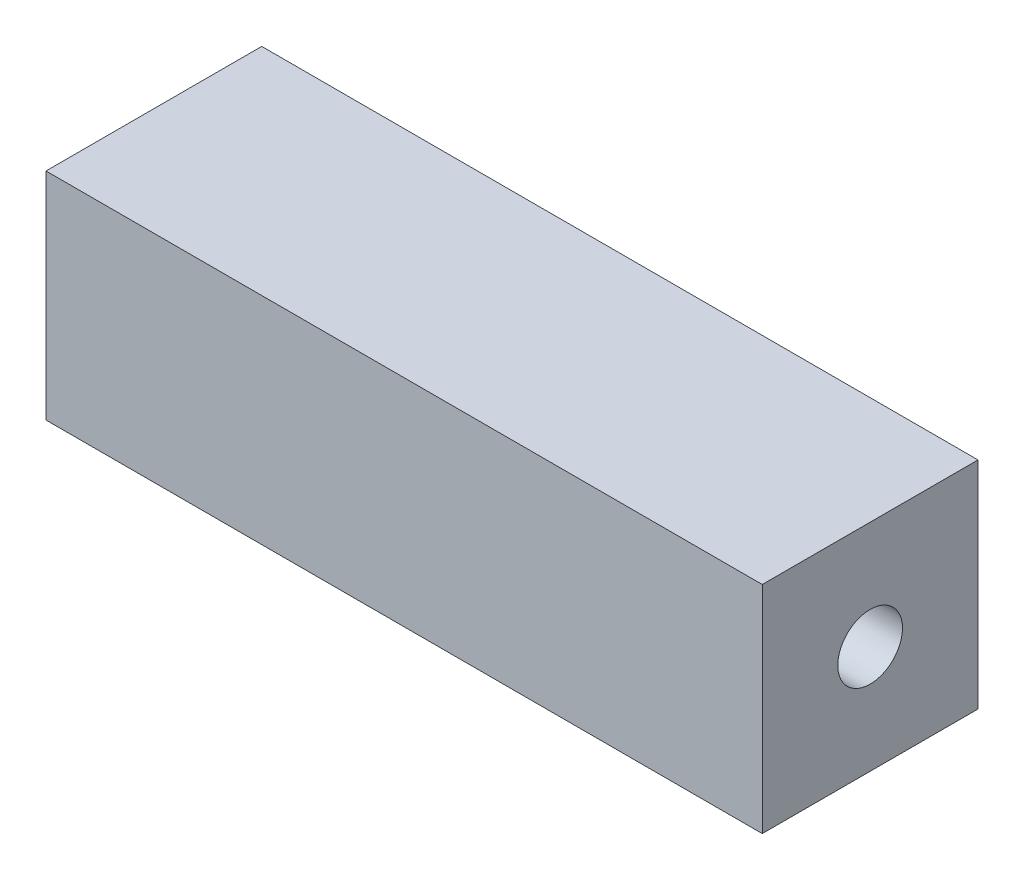
ISO-10303-21;
HEADER;
FILE_DESCRIPTION(('STEP AP214'),'2;1');
FILE_NAME('part.step','',(''),(''),'','','');
FILE_SCHEMA(('AUTOMOTIVE_DESIGN { 1 0 10303 214 1 1 1 1 }'));
ENDSEC;
DATA;
#1=APPLICATION_CONTEXT('core data for automotive mechanical design processes');
#2=APPLICATION_PROTOCOL_DEFINITION('international standard','automotive_design',2000,#1);
#3=PRODUCT_CONTEXT('',#1,'mechanical');
#4=PRODUCT('Part','Part','',(#3));
#5=PRODUCT_RELATED_PRODUCT_CATEGORY('part','',(#4));
#6=PRODUCT_DEFINITION_FORMATION('','',#4);
#7=PRODUCT_DEFINITION_CONTEXT('part definition',#1,'design');
#8=PRODUCT_DEFINITION('design','',#6,#7);
#9=PRODUCT_DEFINITION_SHAPE('','',#8);
#10=(LENGTH_UNIT() NAMED_UNIT(*) SI_UNIT(.MILLI.,.METRE.));
#11=(NAMED_UNIT(*) PLANE_ANGLE_UNIT() SI_UNIT($,.RADIAN.));
#12=(NAMED_UNIT(*) SI_UNIT($,.STERADIAN.) SOLID_ANGLE_UNIT());
#13=UNCERTAINTY_MEASURE_WITH_UNIT(LENGTH_MEASURE(1.E-05),#10,'distance_accuracy_value','');
#14=(GEOMETRIC_REPRESENTATION_CONTEXT(3) GLOBAL_UNCERTAINTY_ASSIGNED_CONTEXT((#13)) GLOBAL_UNIT_ASSIGNED_CONTEXT((#10,
#11,#12)) REPRESENTATION_CONTEXT('',''));
#15=CARTESIAN_POINT('',(0.,0.,0.));
#16=DIRECTION('',(0.,0.,1.));
#17=DIRECTION('',(1.,0.,0.));
#18=AXIS2_PLACEMENT_3D('',#15,#16,#17);
#19=CARTESIAN_POINT('',(16.6,5.,5.));
#20=DIRECTION('',(-1.,0.,0.));
#21=DIRECTION('',(0.,0.,1.));
#22=AXIS2_PLACEMENT_3D('',#19,#20,#21);
#23=PLANE('',#22);
#24=CARTESIAN_POINT('',(16.6,0.,0.));
#25=DIRECTION('',(1.,0.,0.));
#26=DIRECTION('',(0.,0.,-1.));
#27=AXIS2_PLACEMENT_3D('',#24,#25,#26);
#28=CIRCLE('',#27,1.5);
#29=CARTESIAN_POINT('',(16.6,0.,-1.5));
#30=VERTEX_POINT('',#29);
#31=EDGE_CURVE('E112',#30,#30,#28,.T.);
#32=ORIENTED_EDGE('',*,*,#31,.F.);
#33=EDGE_LOOP('',(#32));
#34=FACE_BOUND('',#33,.T.);
#35=DIRECTION('',(0.,0.,-1.));
#36=VECTOR('',#35,1.);
#37=CARTESIAN_POINT('',(16.6,-5.,5.));
#38=LINE('',#37,#36);
#39=CARTESIAN_POINT('',(16.6,-5.,5.));
#40=VERTEX_POINT('',#39);
#41=CARTESIAN_POINT('',(16.6,-5.,-5.));
#42=VERTEX_POINT('',#41);
#43=EDGE_CURVE('E96',#40,#42,#38,.T.);
#44=ORIENTED_EDGE('',*,*,#43,.T.);
#45=DIRECTION('',(0.,-1.,0.));
#46=VECTOR('',#45,1.);
#47=CARTESIAN_POINT('',(16.6,5.,-5.));
#48=LINE('',#47,#46);
#49=CARTESIAN_POINT('',(16.6,5.,-5.));
#50=VERTEX_POINT('',#49);
#51=EDGE_CURVE('E11',#50,#42,#48,.T.);
#52=ORIENTED_EDGE('',*,*,#51,.F.);
#53=DIRECTION('',(0.,0.,-1.));
#54=VECTOR('',#53,1.);
#55=CARTESIAN_POINT('',(16.6,5.,5.));
#56=LINE('',#55,#54);
#57=CARTESIAN_POINT('',(16.6,5.,5.));
#58=VERTEX_POINT('',#57);
#59=EDGE_CURVE('E84',#58,#50,#56,.T.);
#60=ORIENTED_EDGE('',*,*,#59,.F.);
#61=DIRECTION('',(0.,-1.,0.));
#62=VECTOR('',#61,1.);
#63=CARTESIAN_POINT('',(16.6,5.,5.));
#64=LINE('',#63,#62);
#65=EDGE_CURVE('E92',#58,#40,#64,.T.);
#66=ORIENTED_EDGE('',*,*,#65,.T.);
#67=EDGE_LOOP('',(#44,#52,#60,#66));
#68=FACE_BOUND('',#67,.T.);
#69=ADVANCED_FACE('F33',(#34,#68),#23,.F.);
#70=CARTESIAN_POINT('',(-16.6,5.,-5.));
#71=DIRECTION('',(0.,0.,1.));
#72=DIRECTION('',(1.,0.,0.));
#73=AXIS2_PLACEMENT_3D('',#70,#71,#72);
#74=PLANE('',#73);
#75=DIRECTION('',(-1.,0.,0.));
#76=VECTOR('',#75,1.);
#77=CARTESIAN_POINT('',(-16.6,-5.,-5.));
#78=LINE('',#77,#76);
#79=CARTESIAN_POINT('',(-16.6,-5.,-5.));
#80=VERTEX_POINT('',#79);
#81=EDGE_CURVE('E88',#42,#80,#78,.T.);
#82=ORIENTED_EDGE('',*,*,#81,.T.);
#83=DIRECTION('',(0.,-1.,0.));
#84=VECTOR('',#83,1.);
#85=CARTESIAN_POINT('',(-16.6,5.,-5.));
#86=LINE('',#85,#84);
#87=CARTESIAN_POINT('',(-16.6,5.,-5.));
#88=VERTEX_POINT('',#87);
#89=EDGE_CURVE('E41',#88,#80,#86,.T.);
#90=ORIENTED_EDGE('',*,*,#89,.F.);
#91=DIRECTION('',(-1.,0.,0.));
#92=VECTOR('',#91,1.);
#93=CARTESIAN_POINT('',(-16.6,5.,-5.));
#94=LINE('',#93,#92);
#95=EDGE_CURVE('E79',#50,#88,#94,.T.);
#96=ORIENTED_EDGE('',*,*,#95,.F.);
#97=ORIENTED_EDGE('',*,*,#51,.T.);
#98=EDGE_LOOP('',(#82,#90,#96,#97));
#99=FACE_BOUND('',#98,.T.);
#100=ADVANCED_FACE('F87',(#99),#74,.F.);
#101=CARTESIAN_POINT('',(-16.6,5.,5.));
#102=DIRECTION('',(1.,0.,0.));
#103=DIRECTION('',(0.,0.,-1.));
#104=AXIS2_PLACEMENT_3D('',#101,#102,#103);
#105=PLANE('',#104);
#106=CARTESIAN_POINT('',(-16.6,0.,0.));
#107=DIRECTION('',(1.,0.,0.));
#108=DIRECTION('',(0.,0.,-1.));
#109=AXIS2_PLACEMENT_3D('',#106,#107,#108);
#110=CIRCLE('',#109,1.5);
#111=CARTESIAN_POINT('',(-16.6,0.,-1.5));
#112=VERTEX_POINT('',#111);
#113=EDGE_CURVE('E99',#112,#112,#110,.T.);
#114=ORIENTED_EDGE('',*,*,#113,.T.);
#115=EDGE_LOOP('',(#114));
#116=FACE_BOUND('',#115,.T.);
#117=DIRECTION('',(0.,0.,1.));
#118=VECTOR('',#117,1.);
#119=CARTESIAN_POINT('',(-16.6,-5.,5.));
#120=LINE('',#119,#118);
#121=CARTESIAN_POINT('',(-16.6,-5.,5.));
#122=VERTEX_POINT('',#121);
#123=EDGE_CURVE('E66',#80,#122,#120,.T.);
#124=ORIENTED_EDGE('',*,*,#123,.T.);
#125=DIRECTION('',(0.,-1.,0.));
#126=VECTOR('',#125,1.);
#127=CARTESIAN_POINT('',(-16.6,5.,5.));
#128=LINE('',#127,#126);
#129=CARTESIAN_POINT('',(-16.6,5.,5.));
#130=VERTEX_POINT('',#129);
#131=EDGE_CURVE('E89',#130,#122,#128,.T.);
#132=ORIENTED_EDGE('',*,*,#131,.F.);
#133=DIRECTION('',(0.,0.,1.));
#134=VECTOR('',#133,1.);
#135=CARTESIAN_POINT('',(-16.6,5.,5.));
#136=LINE('',#135,#134);
#137=EDGE_CURVE('E82',#88,#130,#136,.T.);
#138=ORIENTED_EDGE('',*,*,#137,.F.);
#139=ORIENTED_EDGE('',*,*,#89,.T.);
#140=EDGE_LOOP('',(#124,#132,#138,#139));
#141=FACE_BOUND('',#140,.T.);
#142=ADVANCED_FACE('F90',(#116,#141),#105,.F.);
#143=CARTESIAN_POINT('',(-16.6,5.,5.));
#144=DIRECTION('',(0.,0.,-1.));
#145=DIRECTION('',(-1.,0.,0.));
#146=AXIS2_PLACEMENT_3D('',#143,#144,#145);
#147=PLANE('',#146);
#148=DIRECTION('',(1.,0.,0.));
#149=VECTOR('',#148,1.);
#150=CARTESIAN_POINT('',(-16.6,-5.,5.));
#151=LINE('',#150,#149);
#152=EDGE_CURVE('E72',#122,#40,#151,.T.);
#153=ORIENTED_EDGE('',*,*,#152,.T.);
#154=ORIENTED_EDGE('',*,*,#65,.F.);
#155=DIRECTION('',(1.,0.,0.));
#156=VECTOR('',#155,1.);
#157=CARTESIAN_POINT('',(-16.6,5.,5.));
#158=LINE('',#157,#156);
#159=EDGE_CURVE('E49',#130,#58,#158,.T.);
#160=ORIENTED_EDGE('',*,*,#159,.F.);
#161=ORIENTED_EDGE('',*,*,#131,.T.);
#162=EDGE_LOOP('',(#153,#154,#160,#161));
#163=FACE_BOUND('',#162,.T.);
#164=ADVANCED_FACE('F104',(#163),#147,.F.);
#165=CARTESIAN_POINT('',(0.,5.,0.));
#166=DIRECTION('',(0.,-1.,0.));
#167=DIRECTION('',(0.,0.,-1.));
#168=AXIS2_PLACEMENT_3D('',#165,#166,#167);
#169=PLANE('',#168);
#170=ORIENTED_EDGE('',*,*,#59,.T.);
#171=ORIENTED_EDGE('',*,*,#95,.T.);
#172=ORIENTED_EDGE('',*,*,#137,.T.);
#173=ORIENTED_EDGE('',*,*,#159,.T.);
#174=EDGE_LOOP('',(#170,#171,#172,#173));
#175=FACE_BOUND('',#174,.T.);
#176=ADVANCED_FACE('F80',(#175),#169,.F.);
#177=CARTESIAN_POINT('',(0.,-5.,0.));
#178=DIRECTION('',(0.,-1.,0.));
#179=DIRECTION('',(0.,0.,-1.));
#180=AXIS2_PLACEMENT_3D('',#177,#178,#179);
#181=PLANE('',#180);
#182=ORIENTED_EDGE('',*,*,#43,.F.);
#183=ORIENTED_EDGE('',*,*,#152,.F.);
#184=ORIENTED_EDGE('',*,*,#123,.F.);
#185=ORIENTED_EDGE('',*,*,#81,.F.);
#186=EDGE_LOOP('',(#182,#183,#184,#185));
#187=FACE_BOUND('',#186,.T.);
#188=ADVANCED_FACE('F107',(#187),#181,.T.);
#189=CARTESIAN_POINT('',(-16.6,0.,0.));
#190=DIRECTION('',(1.,0.,0.));
#191=DIRECTION('',(0.,0.,-1.));
#192=AXIS2_PLACEMENT_3D('',#189,#190,#191);
#193=CYLINDRICAL_SURFACE('',#192,1.5);
#194=ORIENTED_EDGE('',*,*,#113,.F.);
#195=EDGE_LOOP('',(#194));
#196=FACE_BOUND('',#195,.T.);
#197=ORIENTED_EDGE('',*,*,#31,.T.);
#198=EDGE_LOOP('',(#197));
#199=FACE_BOUND('',#198,.T.);
#200=ADVANCED_FACE('F116',(#196,#199),#193,.F.);
#201=CLOSED_SHELL('',(#69,#100,#142,#164,#176,#188,#200));
#202=MANIFOLD_SOLID_BREP('B2',#201);
#203=ADVANCED_BREP_SHAPE_REPRESENTATION('',(#18,#202),#14);
#204=SHAPE_DEFINITION_REPRESENTATION(#9,#203);
ENDSEC;
END-ISO-10303-21;
